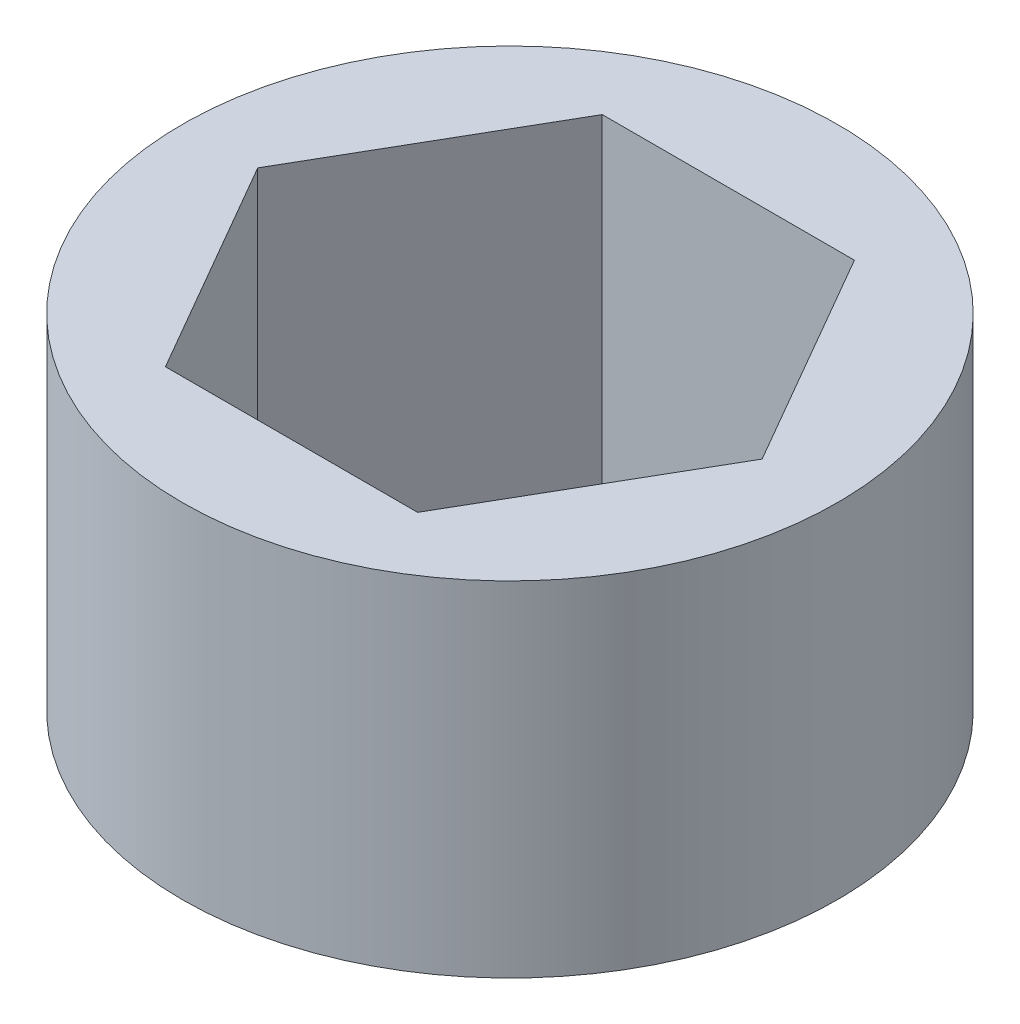
ISO-10303-21;
HEADER;
FILE_DESCRIPTION(('STEP AP214'),'2;1');
FILE_NAME('part.step','',(''),(''),'','','');
FILE_SCHEMA(('AUTOMOTIVE_DESIGN { 1 0 10303 214 1 1 1 1 }'));
ENDSEC;
DATA;
#1=APPLICATION_CONTEXT('core data for automotive mechanical design processes');
#2=APPLICATION_PROTOCOL_DEFINITION('international standard','automotive_design',2000,#1);
#3=PRODUCT_CONTEXT('',#1,'mechanical');
#4=PRODUCT('Part','Part','',(#3));
#5=PRODUCT_RELATED_PRODUCT_CATEGORY('part','',(#4));
#6=PRODUCT_DEFINITION_FORMATION('','',#4);
#7=PRODUCT_DEFINITION_CONTEXT('part definition',#1,'design');
#8=PRODUCT_DEFINITION('design','',#6,#7);
#9=PRODUCT_DEFINITION_SHAPE('','',#8);
#10=(LENGTH_UNIT() NAMED_UNIT(*) SI_UNIT(.MILLI.,.METRE.));
#11=(NAMED_UNIT(*) PLANE_ANGLE_UNIT() SI_UNIT($,.RADIAN.));
#12=(NAMED_UNIT(*) SI_UNIT($,.STERADIAN.) SOLID_ANGLE_UNIT());
#13=UNCERTAINTY_MEASURE_WITH_UNIT(LENGTH_MEASURE(1.E-05),#10,'distance_accuracy_value','');
#14=(GEOMETRIC_REPRESENTATION_CONTEXT(3) GLOBAL_UNCERTAINTY_ASSIGNED_CONTEXT((#13)) GLOBAL_UNIT_ASSIGNED_CONTEXT((#10,
#11,#12)) REPRESENTATION_CONTEXT('',''));
#15=CARTESIAN_POINT('',(0.,0.,0.));
#16=DIRECTION('',(0.,0.,1.));
#17=DIRECTION('',(1.,0.,0.));
#18=AXIS2_PLACEMENT_3D('',#15,#16,#17);
#19=CARTESIAN_POINT('',(0.,10.,0.));
#20=DIRECTION('',(0.,1.,0.));
#21=DIRECTION('',(0.,0.,1.));
#22=AXIS2_PLACEMENT_3D('',#19,#20,#21);
#23=PLANE('',#22);
#24=CARTESIAN_POINT('',(0.,10.,0.));
#25=DIRECTION('',(0.,1.,0.));
#26=DIRECTION('',(0.,0.,1.));
#27=AXIS2_PLACEMENT_3D('',#24,#25,#26);
#28=CIRCLE('',#27,9.525);
#29=CARTESIAN_POINT('',(0.,10.,9.525));
#30=VERTEX_POINT('',#29);
#31=EDGE_CURVE('E11',#30,#30,#28,.T.);
#32=ORIENTED_EDGE('',*,*,#31,.T.);
#33=EDGE_LOOP('',(#32));
#34=FACE_BOUND('',#33,.T.);
#35=DIRECTION('',(-0.500000000000001,0.,-0.866025403784438));
#36=VECTOR('',#35,1.);
#37=CARTESIAN_POINT('',(7.33234841870825,10.,0.));
#38=LINE('',#37,#36);
#39=CARTESIAN_POINT('',(7.33234841870825,10.,0.));
#40=VERTEX_POINT('',#39);
#41=CARTESIAN_POINT('',(3.66617420935411,10.,-6.35000000000001));
#42=VERTEX_POINT('',#41);
#43=EDGE_CURVE('E106',#40,#42,#38,.T.);
#44=ORIENTED_EDGE('',*,*,#43,.F.);
#45=DIRECTION('',(0.499999999999995,0.,-0.866025403784441));
#46=VECTOR('',#45,1.);
#47=CARTESIAN_POINT('',(3.6661742093542,10.,6.34999999999996));
#48=LINE('',#47,#46);
#49=CARTESIAN_POINT('',(3.6661742093542,10.,6.34999999999996));
#50=VERTEX_POINT('',#49);
#51=EDGE_CURVE('E97',#50,#40,#48,.T.);
#52=ORIENTED_EDGE('',*,*,#51,.F.);
#53=DIRECTION('',(1.,0.,0.));
#54=VECTOR('',#53,1.);
#55=CARTESIAN_POINT('',(-3.66617420935407,10.,6.35000000000004));
#56=LINE('',#55,#54);
#57=CARTESIAN_POINT('',(-3.66617420935407,10.,6.35000000000004));
#58=VERTEX_POINT('',#57);
#59=EDGE_CURVE('E131',#58,#50,#56,.T.);
#60=ORIENTED_EDGE('',*,*,#59,.F.);
#61=DIRECTION('',(0.500000000000007,0.,0.866025403784435));
#62=VECTOR('',#61,1.);
#63=CARTESIAN_POINT('',(-7.33234841870825,10.,0.));
#64=LINE('',#63,#62);
#65=CARTESIAN_POINT('',(-7.33234841870825,10.,0.));
#66=VERTEX_POINT('',#65);
#67=EDGE_CURVE('E128',#66,#58,#64,.T.);
#68=ORIENTED_EDGE('',*,*,#67,.F.);
#69=DIRECTION('',(-0.499999999999995,0.,0.866025403784442));
#70=VECTOR('',#69,1.);
#71=CARTESIAN_POINT('',(-3.66617420935416,10.,-6.34999999999999));
#72=LINE('',#71,#70);
#73=CARTESIAN_POINT('',(-3.66617420935416,10.,-6.34999999999999));
#74=VERTEX_POINT('',#73);
#75=EDGE_CURVE('E123',#74,#66,#72,.T.);
#76=ORIENTED_EDGE('',*,*,#75,.F.);
#77=DIRECTION('',(-1.,0.,0.));
#78=VECTOR('',#77,1.);
#79=CARTESIAN_POINT('',(3.66617420935411,10.,-6.35000000000001));
#80=LINE('',#79,#78);
#81=EDGE_CURVE('E119',#42,#74,#80,.T.);
#82=ORIENTED_EDGE('',*,*,#81,.F.);
#83=EDGE_LOOP('',(#44,#52,#60,#68,#76,#82));
#84=FACE_BOUND('',#83,.T.);
#85=ADVANCED_FACE('F43',(#34,#84),#23,.T.);
#86=CARTESIAN_POINT('',(0.,0.,0.));
#87=DIRECTION('',(0.,1.,0.));
#88=DIRECTION('',(0.,0.,1.));
#89=AXIS2_PLACEMENT_3D('',#86,#87,#88);
#90=PLANE('',#89);
#91=CARTESIAN_POINT('',(0.,0.,0.));
#92=DIRECTION('',(0.,1.,0.));
#93=DIRECTION('',(0.,0.,1.));
#94=AXIS2_PLACEMENT_3D('',#91,#92,#93);
#95=CIRCLE('',#94,9.525);
#96=CARTESIAN_POINT('',(0.,0.,9.525));
#97=VERTEX_POINT('',#96);
#98=EDGE_CURVE('E47',#97,#97,#95,.T.);
#99=ORIENTED_EDGE('',*,*,#98,.F.);
#100=EDGE_LOOP('',(#99));
#101=FACE_BOUND('',#100,.T.);
#102=DIRECTION('',(0.499999999999995,0.,-0.866025403784441));
#103=VECTOR('',#102,1.);
#104=CARTESIAN_POINT('',(3.6661742093542,0.,6.34999999999996));
#105=LINE('',#104,#103);
#106=CARTESIAN_POINT('',(3.6661742093542,0.,6.34999999999996));
#107=VERTEX_POINT('',#106);
#108=CARTESIAN_POINT('',(7.33234841870825,0.,0.));
#109=VERTEX_POINT('',#108);
#110=EDGE_CURVE('E67',#107,#109,#105,.T.);
#111=ORIENTED_EDGE('',*,*,#110,.T.);
#112=DIRECTION('',(-0.500000000000001,0.,-0.866025403784438));
#113=VECTOR('',#112,1.);
#114=CARTESIAN_POINT('',(7.33234841870825,0.,0.));
#115=LINE('',#114,#113);
#116=CARTESIAN_POINT('',(3.66617420935411,0.,-6.35000000000001));
#117=VERTEX_POINT('',#116);
#118=EDGE_CURVE('E113',#109,#117,#115,.T.);
#119=ORIENTED_EDGE('',*,*,#118,.T.);
#120=DIRECTION('',(-1.,0.,0.));
#121=VECTOR('',#120,1.);
#122=CARTESIAN_POINT('',(3.66617420935411,0.,-6.35000000000001));
#123=LINE('',#122,#121);
#124=CARTESIAN_POINT('',(-3.66617420935416,0.,-6.34999999999999));
#125=VERTEX_POINT('',#124);
#126=EDGE_CURVE('E138',#117,#125,#123,.T.);
#127=ORIENTED_EDGE('',*,*,#126,.T.);
#128=DIRECTION('',(-0.499999999999995,0.,0.866025403784442));
#129=VECTOR('',#128,1.);
#130=CARTESIAN_POINT('',(-3.66617420935416,0.,-6.34999999999999));
#131=LINE('',#130,#129);
#132=CARTESIAN_POINT('',(-7.33234841870825,0.,0.));
#133=VERTEX_POINT('',#132);
#134=EDGE_CURVE('E142',#125,#133,#131,.T.);
#135=ORIENTED_EDGE('',*,*,#134,.T.);
#136=DIRECTION('',(0.500000000000007,0.,0.866025403784435));
#137=VECTOR('',#136,1.);
#138=CARTESIAN_POINT('',(-7.33234841870825,0.,0.));
#139=LINE('',#138,#137);
#140=CARTESIAN_POINT('',(-3.66617420935407,0.,6.35000000000004));
#141=VERTEX_POINT('',#140);
#142=EDGE_CURVE('E146',#133,#141,#139,.T.);
#143=ORIENTED_EDGE('',*,*,#142,.T.);
#144=DIRECTION('',(1.,0.,0.));
#145=VECTOR('',#144,1.);
#146=CARTESIAN_POINT('',(-3.66617420935407,0.,6.35000000000004));
#147=LINE('',#146,#145);
#148=EDGE_CURVE('E107',#141,#107,#147,.T.);
#149=ORIENTED_EDGE('',*,*,#148,.T.);
#150=EDGE_LOOP('',(#111,#119,#127,#135,#143,#149));
#151=FACE_BOUND('',#150,.T.);
#152=ADVANCED_FACE('F170',(#101,#151),#90,.F.);
#153=CARTESIAN_POINT('',(0.,10.,0.));
#154=DIRECTION('',(0.,-1.,0.));
#155=DIRECTION('',(0.,0.,-1.));
#156=AXIS2_PLACEMENT_3D('',#153,#154,#155);
#157=CYLINDRICAL_SURFACE('',#156,9.525);
#158=ORIENTED_EDGE('',*,*,#31,.F.);
#159=EDGE_LOOP('',(#158));
#160=FACE_BOUND('',#159,.T.);
#161=ORIENTED_EDGE('',*,*,#98,.T.);
#162=EDGE_LOOP('',(#161));
#163=FACE_BOUND('',#162,.T.);
#164=ADVANCED_FACE('F45',(#160,#163),#157,.T.);
#165=CARTESIAN_POINT('',(3.6661742093542,10.,6.34999999999996));
#166=DIRECTION('',(-0.866025403784441,0.,-0.499999999999995));
#167=DIRECTION('',(-0.499999999999995,0.,0.866025403784441));
#168=AXIS2_PLACEMENT_3D('',#165,#166,#167);
#169=PLANE('',#168);
#170=ORIENTED_EDGE('',*,*,#110,.F.);
#171=DIRECTION('',(0.,-1.,0.));
#172=VECTOR('',#171,1.);
#173=CARTESIAN_POINT('',(3.6661742093542,10.,6.34999999999996));
#174=LINE('',#173,#172);
#175=EDGE_CURVE('E101',#50,#107,#174,.T.);
#176=ORIENTED_EDGE('',*,*,#175,.F.);
#177=ORIENTED_EDGE('',*,*,#51,.T.);
#178=DIRECTION('',(0.,-1.,0.));
#179=VECTOR('',#178,1.);
#180=CARTESIAN_POINT('',(7.33234841870825,10.,0.));
#181=LINE('',#180,#179);
#182=EDGE_CURVE('E100',#40,#109,#181,.T.);
#183=ORIENTED_EDGE('',*,*,#182,.T.);
#184=EDGE_LOOP('',(#170,#176,#177,#183));
#185=FACE_BOUND('',#184,.T.);
#186=ADVANCED_FACE('F99',(#185),#169,.T.);
#187=CARTESIAN_POINT('',(7.33234841870825,10.,0.));
#188=DIRECTION('',(-0.866025403784438,0.,0.500000000000001));
#189=DIRECTION('',(0.500000000000001,0.,0.866025403784438));
#190=AXIS2_PLACEMENT_3D('',#187,#188,#189);
#191=PLANE('',#190);
#192=ORIENTED_EDGE('',*,*,#118,.F.);
#193=ORIENTED_EDGE('',*,*,#182,.F.);
#194=ORIENTED_EDGE('',*,*,#43,.T.);
#195=DIRECTION('',(0.,-1.,0.));
#196=VECTOR('',#195,1.);
#197=CARTESIAN_POINT('',(3.66617420935411,10.,-6.35000000000001));
#198=LINE('',#197,#196);
#199=EDGE_CURVE('E115',#42,#117,#198,.T.);
#200=ORIENTED_EDGE('',*,*,#199,.T.);
#201=EDGE_LOOP('',(#192,#193,#194,#200));
#202=FACE_BOUND('',#201,.T.);
#203=ADVANCED_FACE('F110',(#202),#191,.T.);
#204=CARTESIAN_POINT('',(3.66617420935411,10.,-6.35000000000001));
#205=DIRECTION('',(0.,0.,1.));
#206=DIRECTION('',(1.,0.,0.));
#207=AXIS2_PLACEMENT_3D('',#204,#205,#206);
#208=PLANE('',#207);
#209=ORIENTED_EDGE('',*,*,#126,.F.);
#210=ORIENTED_EDGE('',*,*,#199,.F.);
#211=ORIENTED_EDGE('',*,*,#81,.T.);
#212=DIRECTION('',(0.,-1.,0.));
#213=VECTOR('',#212,1.);
#214=CARTESIAN_POINT('',(-3.66617420935416,10.,-6.34999999999999));
#215=LINE('',#214,#213);
#216=EDGE_CURVE('E160',#74,#125,#215,.T.);
#217=ORIENTED_EDGE('',*,*,#216,.T.);
#218=EDGE_LOOP('',(#209,#210,#211,#217));
#219=FACE_BOUND('',#218,.T.);
#220=ADVANCED_FACE('F166',(#219),#208,.T.);
#221=CARTESIAN_POINT('',(-3.66617420935416,10.,-6.34999999999999));
#222=DIRECTION('',(0.866025403784442,0.,0.499999999999995));
#223=DIRECTION('',(0.499999999999995,0.,-0.866025403784442));
#224=AXIS2_PLACEMENT_3D('',#221,#222,#223);
#225=PLANE('',#224);
#226=ORIENTED_EDGE('',*,*,#134,.F.);
#227=ORIENTED_EDGE('',*,*,#216,.F.);
#228=ORIENTED_EDGE('',*,*,#75,.T.);
#229=DIRECTION('',(0.,-1.,0.));
#230=VECTOR('',#229,1.);
#231=CARTESIAN_POINT('',(-7.33234841870825,10.,0.));
#232=LINE('',#231,#230);
#233=EDGE_CURVE('E157',#66,#133,#232,.T.);
#234=ORIENTED_EDGE('',*,*,#233,.T.);
#235=EDGE_LOOP('',(#226,#227,#228,#234));
#236=FACE_BOUND('',#235,.T.);
#237=ADVANCED_FACE('F178',(#236),#225,.T.);
#238=CARTESIAN_POINT('',(-7.33234841870825,10.,0.));
#239=DIRECTION('',(0.866025403784435,0.,-0.500000000000007));
#240=DIRECTION('',(-0.500000000000007,0.,-0.866025403784435));
#241=AXIS2_PLACEMENT_3D('',#238,#239,#240);
#242=PLANE('',#241);
#243=ORIENTED_EDGE('',*,*,#142,.F.);
#244=ORIENTED_EDGE('',*,*,#233,.F.);
#245=ORIENTED_EDGE('',*,*,#67,.T.);
#246=DIRECTION('',(0.,-1.,0.));
#247=VECTOR('',#246,1.);
#248=CARTESIAN_POINT('',(-3.66617420935407,10.,6.35000000000004));
#249=LINE('',#248,#247);
#250=EDGE_CURVE('E59',#58,#141,#249,.T.);
#251=ORIENTED_EDGE('',*,*,#250,.T.);
#252=EDGE_LOOP('',(#243,#244,#245,#251));
#253=FACE_BOUND('',#252,.T.);
#254=ADVANCED_FACE('F176',(#253),#242,.T.);
#255=CARTESIAN_POINT('',(-3.66617420935407,10.,6.35000000000004));
#256=DIRECTION('',(0.,0.,-1.));
#257=DIRECTION('',(-1.,0.,0.));
#258=AXIS2_PLACEMENT_3D('',#255,#256,#257);
#259=PLANE('',#258);
#260=ORIENTED_EDGE('',*,*,#148,.F.);
#261=ORIENTED_EDGE('',*,*,#250,.F.);
#262=ORIENTED_EDGE('',*,*,#59,.T.);
#263=ORIENTED_EDGE('',*,*,#175,.T.);
#264=EDGE_LOOP('',(#260,#261,#262,#263));
#265=FACE_BOUND('',#264,.T.);
#266=ADVANCED_FACE('F172',(#265),#259,.T.);
#267=CLOSED_SHELL('',(#85,#152,#164,#186,#203,#220,#237,#254,#266));
#268=MANIFOLD_SOLID_BREP('B2',#267);
#269=ADVANCED_BREP_SHAPE_REPRESENTATION('',(#18,#268),#14);
#270=SHAPE_DEFINITION_REPRESENTATION(#9,#269);
ENDSEC;
END-ISO-10303-21;
